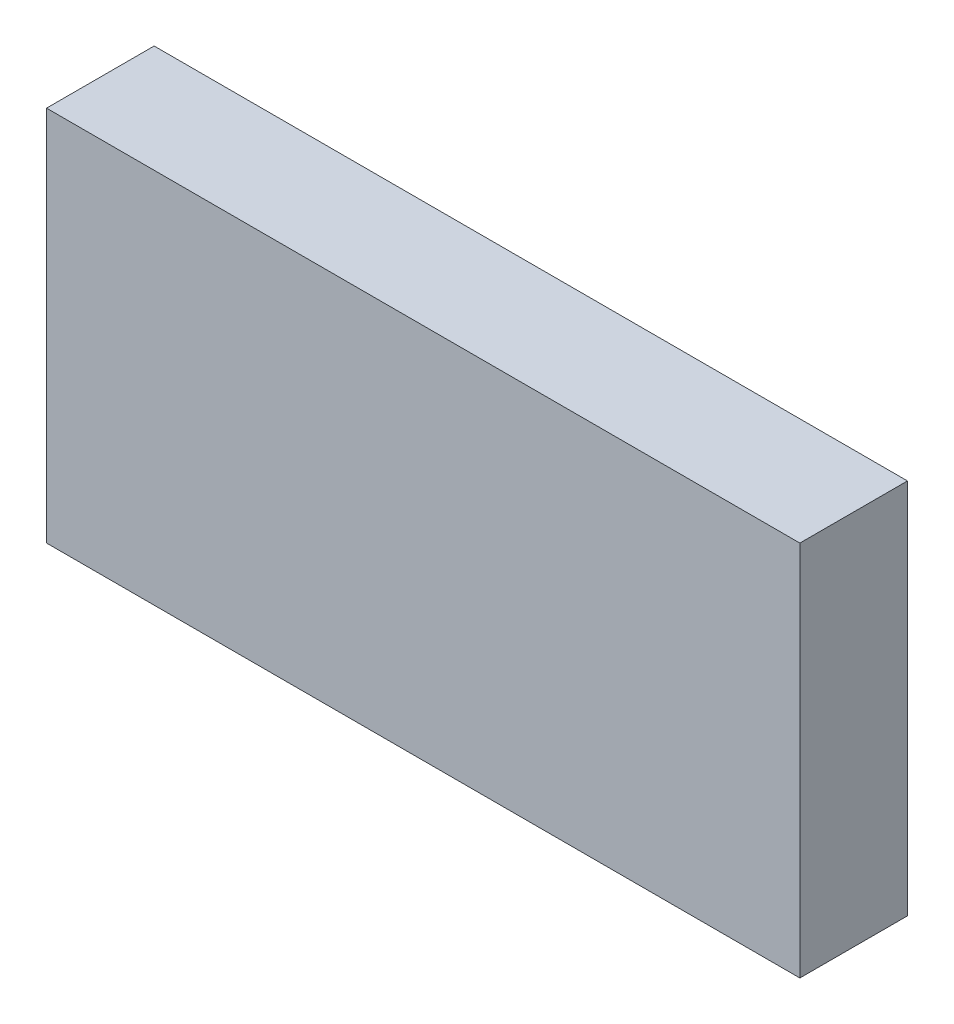
ISO-10303-21;
HEADER;
FILE_DESCRIPTION(('STEP AP214'),'2;1');
FILE_NAME('part.step','',(''),(''),'','','');
FILE_SCHEMA(('AUTOMOTIVE_DESIGN { 1 0 10303 214 1 1 1 1 }'));
ENDSEC;
DATA;
#1=APPLICATION_CONTEXT('core data for automotive mechanical design processes');
#2=APPLICATION_PROTOCOL_DEFINITION('international standard','automotive_design',2000,#1);
#3=PRODUCT_CONTEXT('',#1,'mechanical');
#4=PRODUCT('Part','Part','',(#3));
#5=PRODUCT_RELATED_PRODUCT_CATEGORY('part','',(#4));
#6=PRODUCT_DEFINITION_FORMATION('','',#4);
#7=PRODUCT_DEFINITION_CONTEXT('part definition',#1,'design');
#8=PRODUCT_DEFINITION('design','',#6,#7);
#9=PRODUCT_DEFINITION_SHAPE('','',#8);
#10=(LENGTH_UNIT() NAMED_UNIT(*) SI_UNIT(.MILLI.,.METRE.));
#11=(NAMED_UNIT(*) PLANE_ANGLE_UNIT() SI_UNIT($,.RADIAN.));
#12=(NAMED_UNIT(*) SI_UNIT($,.STERADIAN.) SOLID_ANGLE_UNIT());
#13=UNCERTAINTY_MEASURE_WITH_UNIT(LENGTH_MEASURE(1.E-05),#10,'distance_accuracy_value','');
#14=(GEOMETRIC_REPRESENTATION_CONTEXT(3) GLOBAL_UNCERTAINTY_ASSIGNED_CONTEXT((#13)) GLOBAL_UNIT_ASSIGNED_CONTEXT((#10,
#11,#12)) REPRESENTATION_CONTEXT('',''));
#15=CARTESIAN_POINT('',(0.,0.,0.));
#16=DIRECTION('',(0.,0.,1.));
#17=DIRECTION('',(1.,0.,0.));
#18=AXIS2_PLACEMENT_3D('',#15,#16,#17);
#19=CARTESIAN_POINT('',(70.,-35.,20.));
#20=DIRECTION('',(-1.,0.,0.));
#21=DIRECTION('',(0.,0.,1.));
#22=AXIS2_PLACEMENT_3D('',#19,#20,#21);
#23=PLANE('',#22);
#24=DIRECTION('',(0.,1.,0.));
#25=VECTOR('',#24,1.);
#26=CARTESIAN_POINT('',(70.,-35.,0.));
#27=LINE('',#26,#25);
#28=CARTESIAN_POINT('',(70.,-35.,0.));
#29=VERTEX_POINT('',#28);
#30=CARTESIAN_POINT('',(70.,35.,0.));
#31=VERTEX_POINT('',#30);
#32=EDGE_CURVE('E113',#29,#31,#27,.T.);
#33=ORIENTED_EDGE('',*,*,#32,.T.);
#34=DIRECTION('',(0.,0.,-1.));
#35=VECTOR('',#34,1.);
#36=CARTESIAN_POINT('',(70.,35.,20.));
#37=LINE('',#36,#35);
#38=CARTESIAN_POINT('',(70.,35.,20.));
#39=VERTEX_POINT('',#38);
#40=EDGE_CURVE('E11',#39,#31,#37,.T.);
#41=ORIENTED_EDGE('',*,*,#40,.F.);
#42=DIRECTION('',(0.,1.,0.));
#43=VECTOR('',#42,1.);
#44=CARTESIAN_POINT('',(70.,-35.,20.));
#45=LINE('',#44,#43);
#46=CARTESIAN_POINT('',(70.,-35.,20.));
#47=VERTEX_POINT('',#46);
#48=EDGE_CURVE('E97',#47,#39,#45,.T.);
#49=ORIENTED_EDGE('',*,*,#48,.F.);
#50=DIRECTION('',(0.,0.,-1.));
#51=VECTOR('',#50,1.);
#52=CARTESIAN_POINT('',(70.,-35.,20.));
#53=LINE('',#52,#51);
#54=EDGE_CURVE('E109',#47,#29,#53,.T.);
#55=ORIENTED_EDGE('',*,*,#54,.T.);
#56=EDGE_LOOP('',(#33,#41,#49,#55));
#57=FACE_BOUND('',#56,.T.);
#58=ADVANCED_FACE('F45',(#57),#23,.F.);
#59=CARTESIAN_POINT('',(-70.,35.,20.));
#60=DIRECTION('',(0.,-1.,0.));
#61=DIRECTION('',(0.,0.,-1.));
#62=AXIS2_PLACEMENT_3D('',#59,#60,#61);
#63=PLANE('',#62);
#64=DIRECTION('',(-1.,0.,0.));
#65=VECTOR('',#64,1.);
#66=CARTESIAN_POINT('',(-70.,35.,0.));
#67=LINE('',#66,#65);
#68=CARTESIAN_POINT('',(-70.,35.,0.));
#69=VERTEX_POINT('',#68);
#70=EDGE_CURVE('E102',#31,#69,#67,.T.);
#71=ORIENTED_EDGE('',*,*,#70,.T.);
#72=DIRECTION('',(0.,0.,-1.));
#73=VECTOR('',#72,1.);
#74=CARTESIAN_POINT('',(-70.,35.,20.));
#75=LINE('',#74,#73);
#76=CARTESIAN_POINT('',(-70.,35.,20.));
#77=VERTEX_POINT('',#76);
#78=EDGE_CURVE('E54',#77,#69,#75,.T.);
#79=ORIENTED_EDGE('',*,*,#78,.F.);
#80=DIRECTION('',(-1.,0.,0.));
#81=VECTOR('',#80,1.);
#82=CARTESIAN_POINT('',(-70.,35.,20.));
#83=LINE('',#82,#81);
#84=EDGE_CURVE('E92',#39,#77,#83,.T.);
#85=ORIENTED_EDGE('',*,*,#84,.F.);
#86=ORIENTED_EDGE('',*,*,#40,.T.);
#87=EDGE_LOOP('',(#71,#79,#85,#86));
#88=FACE_BOUND('',#87,.T.);
#89=ADVANCED_FACE('F101',(#88),#63,.F.);
#90=CARTESIAN_POINT('',(-70.,-35.,20.));
#91=DIRECTION('',(1.,0.,0.));
#92=DIRECTION('',(0.,0.,-1.));
#93=AXIS2_PLACEMENT_3D('',#90,#91,#92);
#94=PLANE('',#93);
#95=DIRECTION('',(0.,-1.,0.));
#96=VECTOR('',#95,1.);
#97=CARTESIAN_POINT('',(-70.,-35.,0.));
#98=LINE('',#97,#96);
#99=CARTESIAN_POINT('',(-70.,-35.,0.));
#100=VERTEX_POINT('',#99);
#101=EDGE_CURVE('E79',#69,#100,#98,.T.);
#102=ORIENTED_EDGE('',*,*,#101,.T.);
#103=DIRECTION('',(0.,0.,-1.));
#104=VECTOR('',#103,1.);
#105=CARTESIAN_POINT('',(-70.,-35.,20.));
#106=LINE('',#105,#104);
#107=CARTESIAN_POINT('',(-70.,-35.,20.));
#108=VERTEX_POINT('',#107);
#109=EDGE_CURVE('E104',#108,#100,#106,.T.);
#110=ORIENTED_EDGE('',*,*,#109,.F.);
#111=DIRECTION('',(0.,-1.,0.));
#112=VECTOR('',#111,1.);
#113=CARTESIAN_POINT('',(-70.,-35.,20.));
#114=LINE('',#113,#112);
#115=EDGE_CURVE('E95',#77,#108,#114,.T.);
#116=ORIENTED_EDGE('',*,*,#115,.F.);
#117=ORIENTED_EDGE('',*,*,#78,.T.);
#118=EDGE_LOOP('',(#102,#110,#116,#117));
#119=FACE_BOUND('',#118,.T.);
#120=ADVANCED_FACE('F105',(#119),#94,.F.);
#121=CARTESIAN_POINT('',(-70.,-35.,20.));
#122=DIRECTION('',(0.,1.,0.));
#123=DIRECTION('',(0.,0.,1.));
#124=AXIS2_PLACEMENT_3D('',#121,#122,#123);
#125=PLANE('',#124);
#126=DIRECTION('',(1.,0.,0.));
#127=VECTOR('',#126,1.);
#128=CARTESIAN_POINT('',(-70.,-35.,0.));
#129=LINE('',#128,#127);
#130=EDGE_CURVE('E85',#100,#29,#129,.T.);
#131=ORIENTED_EDGE('',*,*,#130,.T.);
#132=ORIENTED_EDGE('',*,*,#54,.F.);
#133=DIRECTION('',(1.,0.,0.));
#134=VECTOR('',#133,1.);
#135=CARTESIAN_POINT('',(-70.,-35.,20.));
#136=LINE('',#135,#134);
#137=EDGE_CURVE('E62',#108,#47,#136,.T.);
#138=ORIENTED_EDGE('',*,*,#137,.F.);
#139=ORIENTED_EDGE('',*,*,#109,.T.);
#140=EDGE_LOOP('',(#131,#132,#138,#139));
#141=FACE_BOUND('',#140,.T.);
#142=ADVANCED_FACE('F126',(#141),#125,.F.);
#143=CARTESIAN_POINT('',(0.,0.,20.));
#144=DIRECTION('',(0.,0.,-1.));
#145=DIRECTION('',(-1.,0.,0.));
#146=AXIS2_PLACEMENT_3D('',#143,#144,#145);
#147=PLANE('',#146);
#148=ORIENTED_EDGE('',*,*,#48,.T.);
#149=ORIENTED_EDGE('',*,*,#84,.T.);
#150=ORIENTED_EDGE('',*,*,#115,.T.);
#151=ORIENTED_EDGE('',*,*,#137,.T.);
#152=EDGE_LOOP('',(#148,#149,#150,#151));
#153=FACE_BOUND('',#152,.T.);
#154=ADVANCED_FACE('F93',(#153),#147,.F.);
#155=CARTESIAN_POINT('',(0.,0.,0.));
#156=DIRECTION('',(0.,0.,-1.));
#157=DIRECTION('',(-1.,0.,0.));
#158=AXIS2_PLACEMENT_3D('',#155,#156,#157);
#159=PLANE('',#158);
#160=ORIENTED_EDGE('',*,*,#32,.F.);
#161=ORIENTED_EDGE('',*,*,#130,.F.);
#162=ORIENTED_EDGE('',*,*,#101,.F.);
#163=ORIENTED_EDGE('',*,*,#70,.F.);
#164=EDGE_LOOP('',(#160,#161,#162,#163));
#165=FACE_BOUND('',#164,.T.);
#166=ADVANCED_FACE('F129',(#165),#159,.T.);
#167=CLOSED_SHELL('',(#58,#89,#120,#142,#154,#166));
#168=MANIFOLD_SOLID_BREP('B2',#167);
#169=ADVANCED_BREP_SHAPE_REPRESENTATION('',(#18,#168),#14);
#170=SHAPE_DEFINITION_REPRESENTATION(#9,#169);
ENDSEC;
END-ISO-10303-21;
